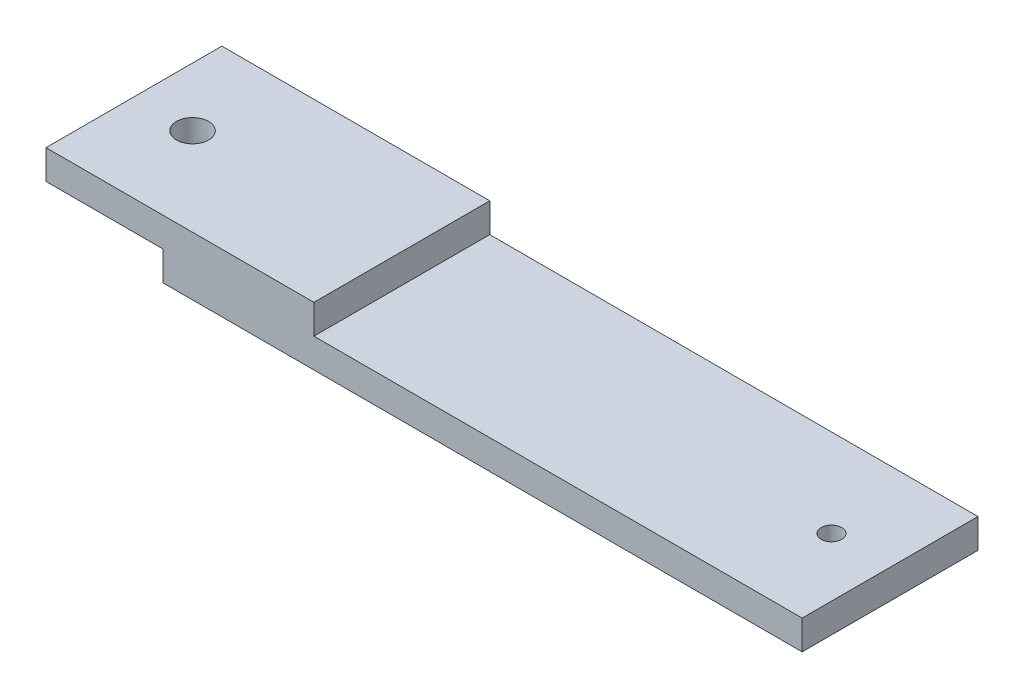
ISO-10303-21;
HEADER;
FILE_DESCRIPTION(('STEP AP214'),'2;1');
FILE_NAME('part.step','',(''),(''),'','','');
FILE_SCHEMA(('AUTOMOTIVE_DESIGN { 1 0 10303 214 1 1 1 1 }'));
ENDSEC;
DATA;
#1=APPLICATION_CONTEXT('core data for automotive mechanical design processes');
#2=APPLICATION_PROTOCOL_DEFINITION('international standard','automotive_design',2000,#1);
#3=PRODUCT_CONTEXT('',#1,'mechanical');
#4=PRODUCT('Part','Part','',(#3));
#5=PRODUCT_RELATED_PRODUCT_CATEGORY('part','',(#4));
#6=PRODUCT_DEFINITION_FORMATION('','',#4);
#7=PRODUCT_DEFINITION_CONTEXT('part definition',#1,'design');
#8=PRODUCT_DEFINITION('design','',#6,#7);
#9=PRODUCT_DEFINITION_SHAPE('','',#8);
#10=(LENGTH_UNIT() NAMED_UNIT(*) SI_UNIT(.MILLI.,.METRE.));
#11=(NAMED_UNIT(*) PLANE_ANGLE_UNIT() SI_UNIT($,.RADIAN.));
#12=(NAMED_UNIT(*) SI_UNIT($,.STERADIAN.) SOLID_ANGLE_UNIT());
#13=UNCERTAINTY_MEASURE_WITH_UNIT(LENGTH_MEASURE(1.E-05),#10,'distance_accuracy_value','');
#14=(GEOMETRIC_REPRESENTATION_CONTEXT(3) GLOBAL_UNCERTAINTY_ASSIGNED_CONTEXT((#13)) GLOBAL_UNIT_ASSIGNED_CONTEXT((#10,
#11,#12)) REPRESENTATION_CONTEXT('',''));
#15=CARTESIAN_POINT('',(0.,0.,0.));
#16=DIRECTION('',(0.,0.,1.));
#17=DIRECTION('',(1.,0.,0.));
#18=AXIS2_PLACEMENT_3D('',#15,#16,#17);
#19=CARTESIAN_POINT('',(0.,10.,0.));
#20=DIRECTION('',(0.,1.,0.));
#21=DIRECTION('',(0.,0.,1.));
#22=AXIS2_PLACEMENT_3D('',#19,#20,#21);
#23=PLANE('',#22);
#24=DIRECTION('',(0.,0.,1.));
#25=VECTOR('',#24,1.);
#26=CARTESIAN_POINT('',(21.5731432836748,10.,-12.8861003861004));
#27=LINE('',#26,#25);
#28=CARTESIAN_POINT('',(21.5731432836748,10.,-12.8861003861004));
#29=VERTEX_POINT('',#28);
#30=CARTESIAN_POINT('',(21.5731432836748,10.,17.1138996138996));
#31=VERTEX_POINT('',#30);
#32=EDGE_CURVE('E188',#29,#31,#27,.T.);
#33=ORIENTED_EDGE('',*,*,#32,.F.);
#34=DIRECTION('',(-1.,0.,0.));
#35=VECTOR('',#34,1.);
#36=CARTESIAN_POINT('',(-24.1312741312741,10.,-12.8861003861004));
#37=LINE('',#36,#35);
#38=CARTESIAN_POINT('',(-24.1312741312741,10.,-12.8861003861004));
#39=VERTEX_POINT('',#38);
#40=EDGE_CURVE('E149',#29,#39,#37,.T.);
#41=ORIENTED_EDGE('',*,*,#40,.T.);
#42=DIRECTION('',(0.,0.,1.));
#43=VECTOR('',#42,1.);
#44=CARTESIAN_POINT('',(-24.1312741312741,10.,-12.8861003861004));
#45=LINE('',#44,#43);
#46=CARTESIAN_POINT('',(-24.1312741312741,10.,17.1138996138996));
#47=VERTEX_POINT('',#46);
#48=EDGE_CURVE('E134',#39,#47,#45,.T.);
#49=ORIENTED_EDGE('',*,*,#48,.T.);
#50=DIRECTION('',(1.,0.,0.));
#51=VECTOR('',#50,1.);
#52=CARTESIAN_POINT('',(-24.1312741312741,10.,17.1138996138996));
#53=LINE('',#52,#51);
#54=EDGE_CURVE('E140',#47,#31,#53,.T.);
#55=ORIENTED_EDGE('',*,*,#54,.T.);
#56=EDGE_LOOP('',(#33,#41,#49,#55));
#57=FACE_BOUND('',#56,.T.);
#58=CARTESIAN_POINT('',(-14.1312741312741,10.,2.11389961389961));
#59=DIRECTION('',(0.,1.,0.));
#60=DIRECTION('',(0.,0.,1.));
#61=AXIS2_PLACEMENT_3D('',#58,#59,#60);
#62=CIRCLE('',#61,2.75);
#63=CARTESIAN_POINT('',(-14.1312741312741,10.,4.86389961389961));
#64=VERTEX_POINT('',#63);
#65=EDGE_CURVE('E199',#64,#64,#62,.T.);
#66=ORIENTED_EDGE('',*,*,#65,.F.);
#67=EDGE_LOOP('',(#66));
#68=FACE_BOUND('',#67,.T.);
#69=ADVANCED_FACE('F39',(#57,#68),#23,.T.);
#70=CARTESIAN_POINT('',(0.,0.,0.));
#71=DIRECTION('',(0.,1.,0.));
#72=DIRECTION('',(0.,0.,1.));
#73=AXIS2_PLACEMENT_3D('',#70,#71,#72);
#74=PLANE('',#73);
#75=DIRECTION('',(1.,0.,0.));
#76=VECTOR('',#75,1.);
#77=CARTESIAN_POINT('',(-24.1312741312741,0.,17.1138996138996));
#78=LINE('',#77,#76);
#79=CARTESIAN_POINT('',(-4.13127413127412,0.,17.1138996138996));
#80=VERTEX_POINT('',#79);
#81=CARTESIAN_POINT('',(104.868725868726,0.,17.1138996138996));
#82=VERTEX_POINT('',#81);
#83=EDGE_CURVE('E126',#80,#82,#78,.T.);
#84=ORIENTED_EDGE('',*,*,#83,.F.);
#85=DIRECTION('',(0.,0.,1.));
#86=VECTOR('',#85,1.);
#87=CARTESIAN_POINT('',(-4.13127413127412,0.,-12.8861003861004));
#88=LINE('',#87,#86);
#89=CARTESIAN_POINT('',(-4.13127413127412,0.,-12.8861003861004));
#90=VERTEX_POINT('',#89);
#91=EDGE_CURVE('E111',#90,#80,#88,.T.);
#92=ORIENTED_EDGE('',*,*,#91,.F.);
#93=DIRECTION('',(-1.,0.,0.));
#94=VECTOR('',#93,1.);
#95=CARTESIAN_POINT('',(-24.1312741312741,0.,-12.8861003861004));
#96=LINE('',#95,#94);
#97=CARTESIAN_POINT('',(104.868725868726,0.,-12.8861003861004));
#98=VERTEX_POINT('',#97);
#99=EDGE_CURVE('E125',#98,#90,#96,.T.);
#100=ORIENTED_EDGE('',*,*,#99,.F.);
#101=DIRECTION('',(0.,0.,-1.));
#102=VECTOR('',#101,1.);
#103=CARTESIAN_POINT('',(104.868725868726,0.,-12.8861003861004));
#104=LINE('',#103,#102);
#105=EDGE_CURVE('E135',#82,#98,#104,.T.);
#106=ORIENTED_EDGE('',*,*,#105,.F.);
#107=EDGE_LOOP('',(#84,#92,#100,#106));
#108=FACE_BOUND('',#107,.T.);
#109=CARTESIAN_POINT('',(94.8687258687259,0.,2.11389961389961));
#110=DIRECTION('',(0.,1.,0.));
#111=DIRECTION('',(0.,0.,1.));
#112=AXIS2_PLACEMENT_3D('',#109,#110,#111);
#113=CIRCLE('',#112,1.75);
#114=CARTESIAN_POINT('',(94.8687258687259,0.,3.86389961389961));
#115=VERTEX_POINT('',#114);
#116=EDGE_CURVE('E163',#115,#115,#113,.T.);
#117=ORIENTED_EDGE('',*,*,#116,.T.);
#118=EDGE_LOOP('',(#117));
#119=FACE_BOUND('',#118,.T.);
#120=ADVANCED_FACE('F122',(#108,#119),#74,.F.);
#121=CARTESIAN_POINT('',(-24.1312741312741,10.,-12.8861003861004));
#122=DIRECTION('',(1.,0.,0.));
#123=DIRECTION('',(0.,0.,-1.));
#124=AXIS2_PLACEMENT_3D('',#121,#122,#123);
#125=PLANE('',#124);
#126=DIRECTION('',(0.,-1.,0.));
#127=VECTOR('',#126,1.);
#128=CARTESIAN_POINT('',(-24.1312741312741,10.,-12.8861003861004));
#129=LINE('',#128,#127);
#130=CARTESIAN_POINT('',(-24.1312741312741,5.,-12.8861003861004));
#131=VERTEX_POINT('',#130);
#132=EDGE_CURVE('E145',#39,#131,#129,.T.);
#133=ORIENTED_EDGE('',*,*,#132,.T.);
#134=DIRECTION('',(0.,0.,1.));
#135=VECTOR('',#134,1.);
#136=CARTESIAN_POINT('',(-24.1312741312741,5.,-12.8861003861004));
#137=LINE('',#136,#135);
#138=CARTESIAN_POINT('',(-24.1312741312741,5.,17.1138996138996));
#139=VERTEX_POINT('',#138);
#140=EDGE_CURVE('E157',#131,#139,#137,.T.);
#141=ORIENTED_EDGE('',*,*,#140,.T.);
#142=DIRECTION('',(0.,-1.,0.));
#143=VECTOR('',#142,1.);
#144=CARTESIAN_POINT('',(-24.1312741312741,10.,17.1138996138996));
#145=LINE('',#144,#143);
#146=EDGE_CURVE('E11',#47,#139,#145,.T.);
#147=ORIENTED_EDGE('',*,*,#146,.F.);
#148=ORIENTED_EDGE('',*,*,#48,.F.);
#149=EDGE_LOOP('',(#133,#141,#147,#148));
#150=FACE_BOUND('',#149,.T.);
#151=ADVANCED_FACE('F41',(#150),#125,.F.);
#152=CARTESIAN_POINT('',(-24.1312741312741,10.,17.1138996138996));
#153=DIRECTION('',(0.,0.,-1.));
#154=DIRECTION('',(-1.,0.,0.));
#155=AXIS2_PLACEMENT_3D('',#152,#153,#154);
#156=PLANE('',#155);
#157=ORIENTED_EDGE('',*,*,#146,.T.);
#158=DIRECTION('',(-1.,0.,0.));
#159=VECTOR('',#158,1.);
#160=CARTESIAN_POINT('',(-24.1312741312741,5.,17.1138996138996));
#161=LINE('',#160,#159);
#162=CARTESIAN_POINT('',(-4.13127413127412,5.,17.1138996138996));
#163=VERTEX_POINT('',#162);
#164=EDGE_CURVE('E117',#163,#139,#161,.T.);
#165=ORIENTED_EDGE('',*,*,#164,.F.);
#166=DIRECTION('',(0.,1.,0.));
#167=VECTOR('',#166,1.);
#168=CARTESIAN_POINT('',(-4.13127413127412,5.,17.1138996138996));
#169=LINE('',#168,#167);
#170=EDGE_CURVE('E191',#80,#163,#169,.T.);
#171=ORIENTED_EDGE('',*,*,#170,.F.);
#172=ORIENTED_EDGE('',*,*,#83,.T.);
#173=DIRECTION('',(0.,-1.,0.));
#174=VECTOR('',#173,1.);
#175=CARTESIAN_POINT('',(104.868725868726,10.,17.1138996138996));
#176=LINE('',#175,#174);
#177=CARTESIAN_POINT('',(104.868725868726,5.,17.1138996138996));
#178=VERTEX_POINT('',#177);
#179=EDGE_CURVE('E49',#178,#82,#176,.T.);
#180=ORIENTED_EDGE('',*,*,#179,.F.);
#181=DIRECTION('',(1.,0.,0.));
#182=VECTOR('',#181,1.);
#183=CARTESIAN_POINT('',(21.5731432836748,5.,17.1138996138996));
#184=LINE('',#183,#182);
#185=CARTESIAN_POINT('',(21.5731432836748,5.,17.1138996138996));
#186=VERTEX_POINT('',#185);
#187=EDGE_CURVE('E178',#186,#178,#184,.T.);
#188=ORIENTED_EDGE('',*,*,#187,.F.);
#189=DIRECTION('',(0.,-1.,0.));
#190=VECTOR('',#189,1.);
#191=CARTESIAN_POINT('',(21.5731432836748,10.,17.1138996138996));
#192=LINE('',#191,#190);
#193=EDGE_CURVE('E182',#31,#186,#192,.T.);
#194=ORIENTED_EDGE('',*,*,#193,.F.);
#195=ORIENTED_EDGE('',*,*,#54,.F.);
#196=EDGE_LOOP('',(#157,#165,#171,#172,#180,#188,#194,#195));
#197=FACE_BOUND('',#196,.T.);
#198=ADVANCED_FACE('F210',(#197),#156,.F.);
#199=CARTESIAN_POINT('',(104.868725868726,10.,-12.8861003861004));
#200=DIRECTION('',(-1.,0.,0.));
#201=DIRECTION('',(0.,0.,1.));
#202=AXIS2_PLACEMENT_3D('',#199,#200,#201);
#203=PLANE('',#202);
#204=DIRECTION('',(0.,-1.,0.));
#205=VECTOR('',#204,1.);
#206=CARTESIAN_POINT('',(104.868725868726,10.,-12.8861003861004));
#207=LINE('',#206,#205);
#208=CARTESIAN_POINT('',(104.868725868726,5.,-12.8861003861004));
#209=VERTEX_POINT('',#208);
#210=EDGE_CURVE('E131',#209,#98,#207,.T.);
#211=ORIENTED_EDGE('',*,*,#210,.F.);
#212=DIRECTION('',(0.,0.,1.));
#213=VECTOR('',#212,1.);
#214=CARTESIAN_POINT('',(104.868725868726,5.,-12.8861003861004));
#215=LINE('',#214,#213);
#216=EDGE_CURVE('E65',#209,#178,#215,.T.);
#217=ORIENTED_EDGE('',*,*,#216,.T.);
#218=ORIENTED_EDGE('',*,*,#179,.T.);
#219=ORIENTED_EDGE('',*,*,#105,.T.);
#220=EDGE_LOOP('',(#211,#217,#218,#219));
#221=FACE_BOUND('',#220,.T.);
#222=ADVANCED_FACE('F214',(#221),#203,.F.);
#223=CARTESIAN_POINT('',(-24.1312741312741,10.,-12.8861003861004));
#224=DIRECTION('',(0.,0.,1.));
#225=DIRECTION('',(1.,0.,0.));
#226=AXIS2_PLACEMENT_3D('',#223,#224,#225);
#227=PLANE('',#226);
#228=DIRECTION('',(0.,1.,0.));
#229=VECTOR('',#228,1.);
#230=CARTESIAN_POINT('',(-4.13127413127412,5.,-12.8861003861004));
#231=LINE('',#230,#229);
#232=CARTESIAN_POINT('',(-4.13127413127412,5.,-12.8861003861004));
#233=VERTEX_POINT('',#232);
#234=EDGE_CURVE('E107',#90,#233,#231,.T.);
#235=ORIENTED_EDGE('',*,*,#234,.T.);
#236=DIRECTION('',(-1.,0.,0.));
#237=VECTOR('',#236,1.);
#238=CARTESIAN_POINT('',(-24.1312741312741,5.,-12.8861003861004));
#239=LINE('',#238,#237);
#240=EDGE_CURVE('E57',#233,#131,#239,.T.);
#241=ORIENTED_EDGE('',*,*,#240,.T.);
#242=ORIENTED_EDGE('',*,*,#132,.F.);
#243=ORIENTED_EDGE('',*,*,#40,.F.);
#244=DIRECTION('',(0.,-1.,0.));
#245=VECTOR('',#244,1.);
#246=CARTESIAN_POINT('',(21.5731432836748,10.,-12.8861003861004));
#247=LINE('',#246,#245);
#248=CARTESIAN_POINT('',(21.5731432836748,5.,-12.8861003861004));
#249=VERTEX_POINT('',#248);
#250=EDGE_CURVE('E173',#29,#249,#247,.T.);
#251=ORIENTED_EDGE('',*,*,#250,.T.);
#252=DIRECTION('',(1.,0.,0.));
#253=VECTOR('',#252,1.);
#254=CARTESIAN_POINT('',(21.5731432836748,5.,-12.8861003861004));
#255=LINE('',#254,#253);
#256=EDGE_CURVE('E177',#249,#209,#255,.T.);
#257=ORIENTED_EDGE('',*,*,#256,.T.);
#258=ORIENTED_EDGE('',*,*,#210,.T.);
#259=ORIENTED_EDGE('',*,*,#99,.T.);
#260=EDGE_LOOP('',(#235,#241,#242,#243,#251,#257,#258,#259));
#261=FACE_BOUND('',#260,.T.);
#262=ADVANCED_FACE('F129',(#261),#227,.F.);
#263=CARTESIAN_POINT('',(-14.1312741312741,10.,2.11389961389961));
#264=DIRECTION('',(0.,-1.,0.));
#265=DIRECTION('',(0.,0.,-1.));
#266=AXIS2_PLACEMENT_3D('',#263,#264,#265);
#267=CYLINDRICAL_SURFACE('',#266,2.75);
#268=CARTESIAN_POINT('',(-14.1312741312741,5.,2.11389961389961));
#269=DIRECTION('',(0.,1.,0.));
#270=DIRECTION('',(0.,0.,1.));
#271=AXIS2_PLACEMENT_3D('',#268,#269,#270);
#272=CIRCLE('',#271,2.75);
#273=CARTESIAN_POINT('',(-14.1312741312741,5.,4.86389961389961));
#274=VERTEX_POINT('',#273);
#275=EDGE_CURVE('E43',#274,#274,#272,.T.);
#276=ORIENTED_EDGE('',*,*,#275,.F.);
#277=EDGE_LOOP('',(#276));
#278=FACE_BOUND('',#277,.T.);
#279=ORIENTED_EDGE('',*,*,#65,.T.);
#280=EDGE_LOOP('',(#279));
#281=FACE_BOUND('',#280,.T.);
#282=ADVANCED_FACE('F221',(#278,#281),#267,.F.);
#283=CARTESIAN_POINT('',(94.8687258687259,10.,2.11389961389961));
#284=DIRECTION('',(0.,-1.,0.));
#285=DIRECTION('',(0.,0.,-1.));
#286=AXIS2_PLACEMENT_3D('',#283,#284,#285);
#287=CYLINDRICAL_SURFACE('',#286,1.75);
#288=CARTESIAN_POINT('',(94.8687258687259,5.,2.11389961389961));
#289=DIRECTION('',(0.,-1.,0.));
#290=DIRECTION('',(0.,0.,-1.));
#291=AXIS2_PLACEMENT_3D('',#288,#289,#290);
#292=CIRCLE('',#291,1.75);
#293=CARTESIAN_POINT('',(94.8687258687259,5.,0.363899613899617));
#294=VERTEX_POINT('',#293);
#295=EDGE_CURVE('E154',#294,#294,#292,.T.);
#296=ORIENTED_EDGE('',*,*,#295,.F.);
#297=EDGE_LOOP('',(#296));
#298=FACE_BOUND('',#297,.T.);
#299=ORIENTED_EDGE('',*,*,#116,.F.);
#300=EDGE_LOOP('',(#299));
#301=FACE_BOUND('',#300,.T.);
#302=ADVANCED_FACE('F235',(#298,#301),#287,.F.);
#303=CARTESIAN_POINT('',(21.5731432836748,10.,-12.8861003861004));
#304=DIRECTION('',(-1.,0.,0.));
#305=DIRECTION('',(0.,0.,1.));
#306=AXIS2_PLACEMENT_3D('',#303,#304,#305);
#307=PLANE('',#306);
#308=ORIENTED_EDGE('',*,*,#193,.T.);
#309=DIRECTION('',(0.,0.,1.));
#310=VECTOR('',#309,1.);
#311=CARTESIAN_POINT('',(21.5731432836748,5.,-12.8861003861004));
#312=LINE('',#311,#310);
#313=EDGE_CURVE('E181',#249,#186,#312,.T.);
#314=ORIENTED_EDGE('',*,*,#313,.F.);
#315=ORIENTED_EDGE('',*,*,#250,.F.);
#316=ORIENTED_EDGE('',*,*,#32,.T.);
#317=EDGE_LOOP('',(#308,#314,#315,#316));
#318=FACE_BOUND('',#317,.T.);
#319=ADVANCED_FACE('F239',(#318),#307,.F.);
#320=CARTESIAN_POINT('',(21.5731432836748,5.,-12.8861003861004));
#321=DIRECTION('',(0.,-1.,0.));
#322=DIRECTION('',(0.,0.,-1.));
#323=AXIS2_PLACEMENT_3D('',#320,#321,#322);
#324=PLANE('',#323);
#325=ORIENTED_EDGE('',*,*,#295,.T.);
#326=EDGE_LOOP('',(#325));
#327=FACE_BOUND('',#326,.T.);
#328=ORIENTED_EDGE('',*,*,#187,.T.);
#329=ORIENTED_EDGE('',*,*,#216,.F.);
#330=ORIENTED_EDGE('',*,*,#256,.F.);
#331=ORIENTED_EDGE('',*,*,#313,.T.);
#332=EDGE_LOOP('',(#328,#329,#330,#331));
#333=FACE_BOUND('',#332,.T.);
#334=ADVANCED_FACE('F243',(#327,#333),#324,.F.);
#335=CARTESIAN_POINT('',(-24.1312741312741,5.,-12.8861003861004));
#336=DIRECTION('',(0.,1.,0.));
#337=DIRECTION('',(0.,0.,1.));
#338=AXIS2_PLACEMENT_3D('',#335,#336,#337);
#339=PLANE('',#338);
#340=ORIENTED_EDGE('',*,*,#275,.T.);
#341=EDGE_LOOP('',(#340));
#342=FACE_BOUND('',#341,.T.);
#343=ORIENTED_EDGE('',*,*,#164,.T.);
#344=ORIENTED_EDGE('',*,*,#140,.F.);
#345=ORIENTED_EDGE('',*,*,#240,.F.);
#346=DIRECTION('',(0.,0.,1.));
#347=VECTOR('',#346,1.);
#348=CARTESIAN_POINT('',(-4.13127413127412,5.,-12.8861003861004));
#349=LINE('',#348,#347);
#350=EDGE_CURVE('E113',#233,#163,#349,.T.);
#351=ORIENTED_EDGE('',*,*,#350,.T.);
#352=EDGE_LOOP('',(#343,#344,#345,#351));
#353=FACE_BOUND('',#352,.T.);
#354=ADVANCED_FACE('F247',(#342,#353),#339,.F.);
#355=CARTESIAN_POINT('',(-4.13127413127412,5.,-12.8861003861004));
#356=DIRECTION('',(1.,0.,0.));
#357=DIRECTION('',(0.,0.,-1.));
#358=AXIS2_PLACEMENT_3D('',#355,#356,#357);
#359=PLANE('',#358);
#360=ORIENTED_EDGE('',*,*,#170,.T.);
#361=ORIENTED_EDGE('',*,*,#350,.F.);
#362=ORIENTED_EDGE('',*,*,#234,.F.);
#363=ORIENTED_EDGE('',*,*,#91,.T.);
#364=EDGE_LOOP('',(#360,#361,#362,#363));
#365=FACE_BOUND('',#364,.T.);
#366=ADVANCED_FACE('F110',(#365),#359,.F.);
#367=CLOSED_SHELL('',(#69,#120,#151,#198,#222,#262,#282,#302,#319,#334,#354,#366));
#368=MANIFOLD_SOLID_BREP('B2',#367);
#369=ADVANCED_BREP_SHAPE_REPRESENTATION('',(#18,#368),#14);
#370=SHAPE_DEFINITION_REPRESENTATION(#9,#369);
ENDSEC;
END-ISO-10303-21;
